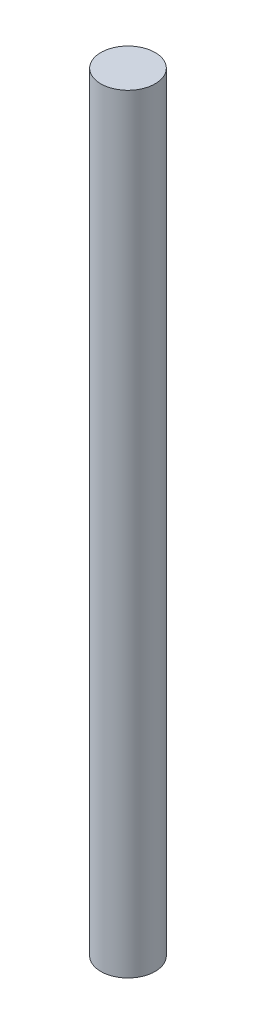
ISO-10303-21;
HEADER;
FILE_DESCRIPTION(('STEP AP214'),'2;1');
FILE_NAME('part.step','',(''),(''),'','','');
FILE_SCHEMA(('AUTOMOTIVE_DESIGN { 1 0 10303 214 1 1 1 1 }'));
ENDSEC;
DATA;
#1=APPLICATION_CONTEXT('core data for automotive mechanical design processes');
#2=APPLICATION_PROTOCOL_DEFINITION('international standard','automotive_design',2000,#1);
#3=PRODUCT_CONTEXT('',#1,'mechanical');
#4=PRODUCT('Part','Part','',(#3));
#5=PRODUCT_RELATED_PRODUCT_CATEGORY('part','',(#4));
#6=PRODUCT_DEFINITION_FORMATION('','',#4);
#7=PRODUCT_DEFINITION_CONTEXT('part definition',#1,'design');
#8=PRODUCT_DEFINITION('design','',#6,#7);
#9=PRODUCT_DEFINITION_SHAPE('','',#8);
#10=(LENGTH_UNIT() NAMED_UNIT(*) SI_UNIT(.MILLI.,.METRE.));
#11=(NAMED_UNIT(*) PLANE_ANGLE_UNIT() SI_UNIT($,.RADIAN.));
#12=(NAMED_UNIT(*) SI_UNIT($,.STERADIAN.) SOLID_ANGLE_UNIT());
#13=UNCERTAINTY_MEASURE_WITH_UNIT(LENGTH_MEASURE(1.E-05),#10,'distance_accuracy_value','');
#14=(GEOMETRIC_REPRESENTATION_CONTEXT(3) GLOBAL_UNCERTAINTY_ASSIGNED_CONTEXT((#13)) GLOBAL_UNIT_ASSIGNED_CONTEXT((#10,
#11,#12)) REPRESENTATION_CONTEXT('',''));
#15=CARTESIAN_POINT('',(0.,0.,0.));
#16=DIRECTION('',(0.,0.,1.));
#17=DIRECTION('',(1.,0.,0.));
#18=AXIS2_PLACEMENT_3D('',#15,#16,#17);
#19=CARTESIAN_POINT('',(0.,170.,0.));
#20=DIRECTION('',(0.,-1.,0.));
#21=DIRECTION('',(0.,0.,-1.));
#22=AXIS2_PLACEMENT_3D('',#19,#20,#21);
#23=CYLINDRICAL_SURFACE('',#22,6.);
#24=CARTESIAN_POINT('',(0.,170.,0.));
#25=DIRECTION('',(0.,1.,0.));
#26=DIRECTION('',(0.,0.,1.));
#27=AXIS2_PLACEMENT_3D('',#24,#25,#26);
#28=CIRCLE('',#27,6.);
#29=CARTESIAN_POINT('',(0.,170.,6.));
#30=VERTEX_POINT('',#29);
#31=EDGE_CURVE('E10',#30,#30,#28,.T.);
#32=ORIENTED_EDGE('',*,*,#31,.F.);
#33=EDGE_LOOP('',(#32));
#34=FACE_BOUND('',#33,.T.);
#35=CARTESIAN_POINT('',(0.,0.,0.));
#36=DIRECTION('',(0.,1.,0.));
#37=DIRECTION('',(0.,0.,1.));
#38=AXIS2_PLACEMENT_3D('',#35,#36,#37);
#39=CIRCLE('',#38,6.);
#40=CARTESIAN_POINT('',(0.,0.,6.));
#41=VERTEX_POINT('',#40);
#42=EDGE_CURVE('E36',#41,#41,#39,.T.);
#43=ORIENTED_EDGE('',*,*,#42,.T.);
#44=EDGE_LOOP('',(#43));
#45=FACE_BOUND('',#44,.T.);
#46=ADVANCED_FACE('F33',(#34,#45),#23,.T.);
#47=CARTESIAN_POINT('',(0.,170.,0.));
#48=DIRECTION('',(0.,1.,0.));
#49=DIRECTION('',(0.,0.,1.));
#50=AXIS2_PLACEMENT_3D('',#47,#48,#49);
#51=PLANE('',#50);
#52=ORIENTED_EDGE('',*,*,#31,.T.);
#53=EDGE_LOOP('',(#52));
#54=FACE_BOUND('',#53,.T.);
#55=ADVANCED_FACE('F48',(#54),#51,.T.);
#56=CARTESIAN_POINT('',(0.,0.,0.));
#57=DIRECTION('',(0.,1.,0.));
#58=DIRECTION('',(0.,0.,1.));
#59=AXIS2_PLACEMENT_3D('',#56,#57,#58);
#60=PLANE('',#59);
#61=ORIENTED_EDGE('',*,*,#42,.F.);
#62=EDGE_LOOP('',(#61));
#63=FACE_BOUND('',#62,.T.);
#64=ADVANCED_FACE('F46',(#63),#60,.F.);
#65=CLOSED_SHELL('',(#46,#55,#64));
#66=MANIFOLD_SOLID_BREP('B2',#65);
#67=ADVANCED_BREP_SHAPE_REPRESENTATION('',(#18,#66),#14);
#68=SHAPE_DEFINITION_REPRESENTATION(#9,#67);
ENDSEC;
END-ISO-10303-21;
